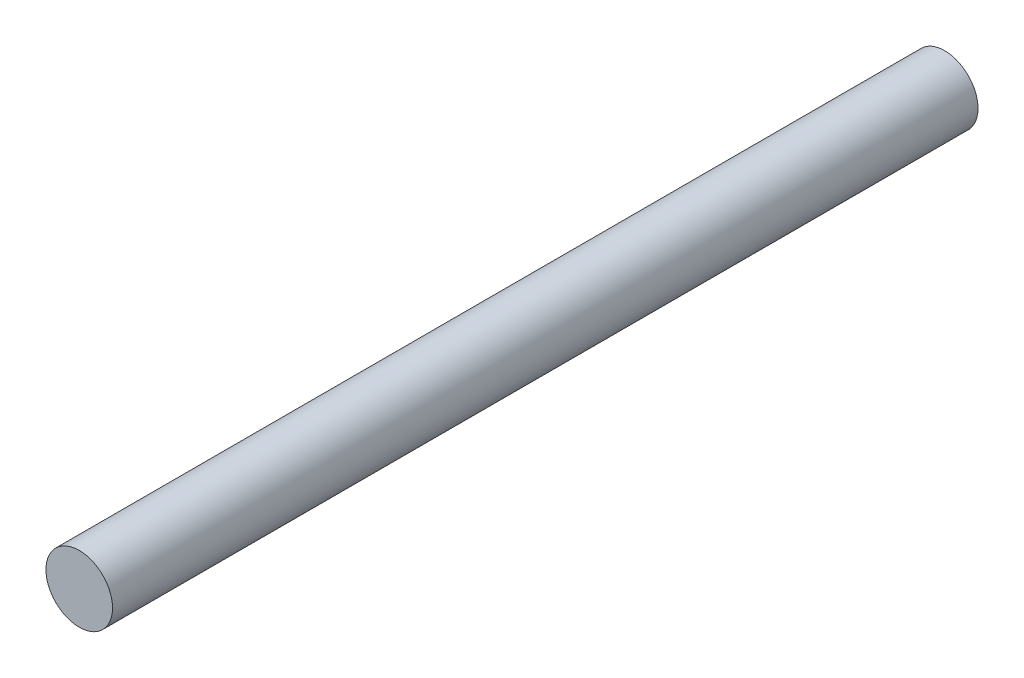
ISO-10303-21;
HEADER;
FILE_DESCRIPTION(('STEP AP214'),'2;1');
FILE_NAME('part.step','',(''),(''),'','','');
FILE_SCHEMA(('AUTOMOTIVE_DESIGN { 1 0 10303 214 1 1 1 1 }'));
ENDSEC;
DATA;
#1=APPLICATION_CONTEXT('core data for automotive mechanical design processes');
#2=APPLICATION_PROTOCOL_DEFINITION('international standard','automotive_design',2000,#1);
#3=PRODUCT_CONTEXT('',#1,'mechanical');
#4=PRODUCT('Part','Part','',(#3));
#5=PRODUCT_RELATED_PRODUCT_CATEGORY('part','',(#4));
#6=PRODUCT_DEFINITION_FORMATION('','',#4);
#7=PRODUCT_DEFINITION_CONTEXT('part definition',#1,'design');
#8=PRODUCT_DEFINITION('design','',#6,#7);
#9=PRODUCT_DEFINITION_SHAPE('','',#8);
#10=(LENGTH_UNIT() NAMED_UNIT(*) SI_UNIT(.MILLI.,.METRE.));
#11=(NAMED_UNIT(*) PLANE_ANGLE_UNIT() SI_UNIT($,.RADIAN.));
#12=(NAMED_UNIT(*) SI_UNIT($,.STERADIAN.) SOLID_ANGLE_UNIT());
#13=UNCERTAINTY_MEASURE_WITH_UNIT(LENGTH_MEASURE(1.E-05),#10,'distance_accuracy_value','');
#14=(GEOMETRIC_REPRESENTATION_CONTEXT(3) GLOBAL_UNCERTAINTY_ASSIGNED_CONTEXT((#13)) GLOBAL_UNIT_ASSIGNED_CONTEXT((#10,
#11,#12)) REPRESENTATION_CONTEXT('',''));
#15=CARTESIAN_POINT('',(0.,0.,0.));
#16=DIRECTION('',(0.,0.,1.));
#17=DIRECTION('',(1.,0.,0.));
#18=AXIS2_PLACEMENT_3D('',#15,#16,#17);
#19=CARTESIAN_POINT('',(0.,0.,78.));
#20=DIRECTION('',(0.,0.,-1.));
#21=DIRECTION('',(-1.,0.,0.));
#22=AXIS2_PLACEMENT_3D('',#19,#20,#21);
#23=CYLINDRICAL_SURFACE('',#22,3.);
#24=CARTESIAN_POINT('',(0.,0.,78.));
#25=DIRECTION('',(0.,0.,1.));
#26=DIRECTION('',(1.,0.,0.));
#27=AXIS2_PLACEMENT_3D('',#24,#25,#26);
#28=CIRCLE('',#27,3.);
#29=CARTESIAN_POINT('',(3.,0.,78.));
#30=VERTEX_POINT('',#29);
#31=EDGE_CURVE('E10',#30,#30,#28,.T.);
#32=ORIENTED_EDGE('',*,*,#31,.F.);
#33=EDGE_LOOP('',(#32));
#34=FACE_BOUND('',#33,.T.);
#35=CARTESIAN_POINT('',(0.,0.,0.));
#36=DIRECTION('',(0.,0.,1.));
#37=DIRECTION('',(1.,0.,0.));
#38=AXIS2_PLACEMENT_3D('',#35,#36,#37);
#39=CIRCLE('',#38,3.);
#40=CARTESIAN_POINT('',(3.,0.,0.));
#41=VERTEX_POINT('',#40);
#42=EDGE_CURVE('E34',#41,#41,#39,.T.);
#43=ORIENTED_EDGE('',*,*,#42,.T.);
#44=EDGE_LOOP('',(#43));
#45=FACE_BOUND('',#44,.T.);
#46=ADVANCED_FACE('F31',(#34,#45),#23,.T.);
#47=CARTESIAN_POINT('',(0.,0.,78.));
#48=DIRECTION('',(0.,0.,1.));
#49=DIRECTION('',(1.,0.,0.));
#50=AXIS2_PLACEMENT_3D('',#47,#48,#49);
#51=PLANE('',#50);
#52=ORIENTED_EDGE('',*,*,#31,.T.);
#53=EDGE_LOOP('',(#52));
#54=FACE_BOUND('',#53,.T.);
#55=ADVANCED_FACE('F46',(#54),#51,.T.);
#56=CARTESIAN_POINT('',(0.,0.,0.));
#57=DIRECTION('',(0.,0.,1.));
#58=DIRECTION('',(1.,0.,0.));
#59=AXIS2_PLACEMENT_3D('',#56,#57,#58);
#60=PLANE('',#59);
#61=ORIENTED_EDGE('',*,*,#42,.F.);
#62=EDGE_LOOP('',(#61));
#63=FACE_BOUND('',#62,.T.);
#64=ADVANCED_FACE('F44',(#63),#60,.F.);
#65=CLOSED_SHELL('',(#46,#55,#64));
#66=MANIFOLD_SOLID_BREP('B2',#65);
#67=ADVANCED_BREP_SHAPE_REPRESENTATION('',(#18,#66),#14);
#68=SHAPE_DEFINITION_REPRESENTATION(#9,#67);
ENDSEC;
END-ISO-10303-21;
